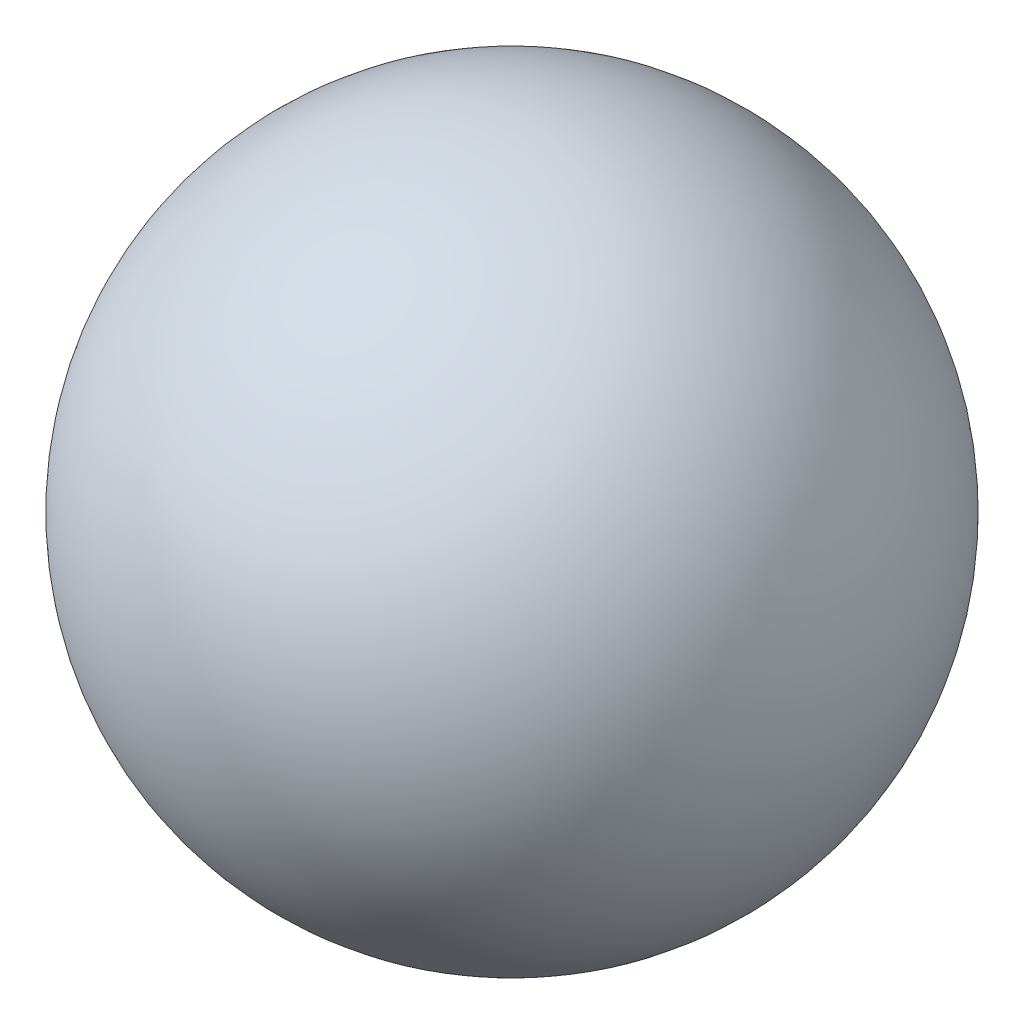
ISO-10303-21;
HEADER;
FILE_DESCRIPTION(('STEP AP214'),'2;1');
FILE_NAME('part.step','',(''),(''),'','','');
FILE_SCHEMA(('AUTOMOTIVE_DESIGN { 1 0 10303 214 1 1 1 1 }'));
ENDSEC;
DATA;
#1=APPLICATION_CONTEXT('core data for automotive mechanical design processes');
#2=APPLICATION_PROTOCOL_DEFINITION('international standard','automotive_design',2000,#1);
#3=PRODUCT_CONTEXT('',#1,'mechanical');
#4=PRODUCT('Part','Part','',(#3));
#5=PRODUCT_RELATED_PRODUCT_CATEGORY('part','',(#4));
#6=PRODUCT_DEFINITION_FORMATION('','',#4);
#7=PRODUCT_DEFINITION_CONTEXT('part definition',#1,'design');
#8=PRODUCT_DEFINITION('design','',#6,#7);
#9=PRODUCT_DEFINITION_SHAPE('','',#8);
#10=(LENGTH_UNIT() NAMED_UNIT(*) SI_UNIT(.MILLI.,.METRE.));
#11=(NAMED_UNIT(*) PLANE_ANGLE_UNIT() SI_UNIT($,.RADIAN.));
#12=(NAMED_UNIT(*) SI_UNIT($,.STERADIAN.) SOLID_ANGLE_UNIT());
#13=UNCERTAINTY_MEASURE_WITH_UNIT(LENGTH_MEASURE(1.E-05),#10,'distance_accuracy_value','');
#14=(GEOMETRIC_REPRESENTATION_CONTEXT(3) GLOBAL_UNCERTAINTY_ASSIGNED_CONTEXT((#13)) GLOBAL_UNIT_ASSIGNED_CONTEXT((#10,
#11,#12)) REPRESENTATION_CONTEXT('',''));
#15=CARTESIAN_POINT('',(0.,0.,0.));
#16=DIRECTION('',(0.,0.,1.));
#17=DIRECTION('',(1.,0.,0.));
#18=AXIS2_PLACEMENT_3D('',#15,#16,#17);
#19=CARTESIAN_POINT('',(0.,0.,0.));
#20=DIRECTION('',(0.,-1.,0.));
#21=DIRECTION('',(-1.,0.,0.));
#22=AXIS2_PLACEMENT_3D('',#19,#20,#21);
#23=SPHERICAL_SURFACE('',#22,8.);
#24=CARTESIAN_POINT('',(0.,-8.,0.));
#25=VERTEX_POINT('',#24);
#26=VERTEX_LOOP('',#25);
#27=FACE_BOUND('',#26,.T.);
#28=ADVANCED_FACE('F34',(#27),#23,.T.);
#29=CLOSED_SHELL('',(#28));
#30=MANIFOLD_SOLID_BREP('B2',#29);
#31=ADVANCED_BREP_SHAPE_REPRESENTATION('',(#18,#30),#14);
#32=SHAPE_DEFINITION_REPRESENTATION(#9,#31);
ENDSEC;
END-ISO-10303-21;
